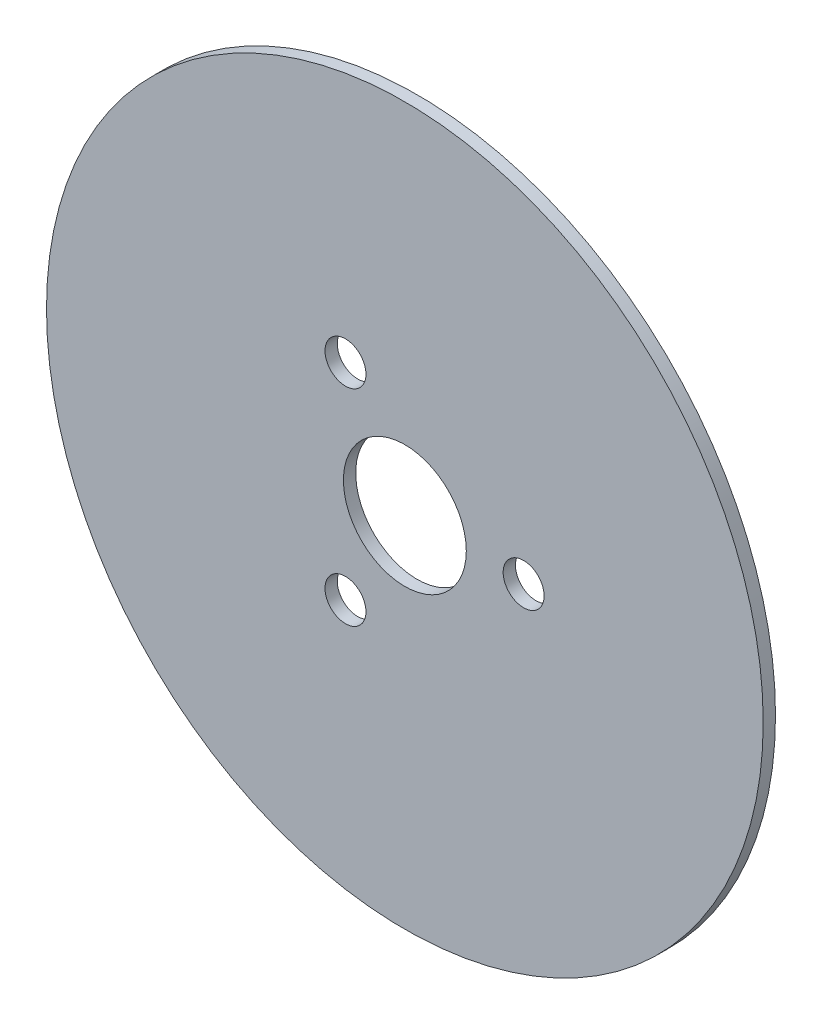
ISO-10303-21;
HEADER;
FILE_DESCRIPTION(('STEP AP214'),'2;1');
FILE_NAME('part.step','',(''),(''),'','','');
FILE_SCHEMA(('AUTOMOTIVE_DESIGN { 1 0 10303 214 1 1 1 1 }'));
ENDSEC;
DATA;
#1=APPLICATION_CONTEXT('core data for automotive mechanical design processes');
#2=APPLICATION_PROTOCOL_DEFINITION('international standard','automotive_design',2000,#1);
#3=PRODUCT_CONTEXT('',#1,'mechanical');
#4=PRODUCT('Part','Part','',(#3));
#5=PRODUCT_RELATED_PRODUCT_CATEGORY('part','',(#4));
#6=PRODUCT_DEFINITION_FORMATION('','',#4);
#7=PRODUCT_DEFINITION_CONTEXT('part definition',#1,'design');
#8=PRODUCT_DEFINITION('design','',#6,#7);
#9=PRODUCT_DEFINITION_SHAPE('','',#8);
#10=(LENGTH_UNIT() NAMED_UNIT(*) SI_UNIT(.MILLI.,.METRE.));
#11=(NAMED_UNIT(*) PLANE_ANGLE_UNIT() SI_UNIT($,.RADIAN.));
#12=(NAMED_UNIT(*) SI_UNIT($,.STERADIAN.) SOLID_ANGLE_UNIT());
#13=UNCERTAINTY_MEASURE_WITH_UNIT(LENGTH_MEASURE(1.E-05),#10,'distance_accuracy_value','');
#14=(GEOMETRIC_REPRESENTATION_CONTEXT(3) GLOBAL_UNCERTAINTY_ASSIGNED_CONTEXT((#13)) GLOBAL_UNIT_ASSIGNED_CONTEXT((#10,
#11,#12)) REPRESENTATION_CONTEXT('',''));
#15=CARTESIAN_POINT('',(0.,0.,0.));
#16=DIRECTION('',(0.,0.,1.));
#17=DIRECTION('',(1.,0.,0.));
#18=AXIS2_PLACEMENT_3D('',#15,#16,#17);
#19=CARTESIAN_POINT('',(0.,0.,3.));
#20=DIRECTION('',(0.,0.,1.));
#21=DIRECTION('',(1.,0.,0.));
#22=AXIS2_PLACEMENT_3D('',#19,#20,#21);
#23=PLANE('',#22);
#24=CARTESIAN_POINT('',(-14.5000000000001,-25.1147367097486,3.));
#25=DIRECTION('',(0.,0.,1.));
#26=DIRECTION('',(1.,0.,0.));
#27=AXIS2_PLACEMENT_3D('',#24,#25,#26);
#28=CIRCLE('',#27,5.);
#29=CARTESIAN_POINT('',(-9.50000000000012,-25.1147367097486,3.));
#30=VERTEX_POINT('',#29);
#31=EDGE_CURVE('E68',#30,#30,#28,.T.);
#32=ORIENTED_EDGE('',*,*,#31,.F.);
#33=EDGE_LOOP('',(#32));
#34=FACE_BOUND('',#33,.T.);
#35=CARTESIAN_POINT('',(0.,0.,3.));
#36=DIRECTION('',(0.,0.,1.));
#37=DIRECTION('',(1.,0.,0.));
#38=AXIS2_PLACEMENT_3D('',#35,#36,#37);
#39=CIRCLE('',#38,15.);
#40=CARTESIAN_POINT('',(15.,0.,3.));
#41=VERTEX_POINT('',#40);
#42=EDGE_CURVE('E54',#41,#41,#39,.T.);
#43=ORIENTED_EDGE('',*,*,#42,.F.);
#44=EDGE_LOOP('',(#43));
#45=FACE_BOUND('',#44,.T.);
#46=CARTESIAN_POINT('',(0.,0.,3.));
#47=DIRECTION('',(0.,0.,1.));
#48=DIRECTION('',(1.,0.,0.));
#49=AXIS2_PLACEMENT_3D('',#46,#47,#48);
#50=CIRCLE('',#49,87.5);
#51=CARTESIAN_POINT('',(87.5,0.,3.));
#52=VERTEX_POINT('',#51);
#53=EDGE_CURVE('E10',#52,#52,#50,.T.);
#54=ORIENTED_EDGE('',*,*,#53,.T.);
#55=EDGE_LOOP('',(#54));
#56=FACE_BOUND('',#55,.T.);
#57=CARTESIAN_POINT('',(29.,0.,3.));
#58=DIRECTION('',(0.,0.,1.));
#59=DIRECTION('',(1.,0.,0.));
#60=AXIS2_PLACEMENT_3D('',#57,#58,#59);
#61=CIRCLE('',#60,5.);
#62=CARTESIAN_POINT('',(34.,0.,3.));
#63=VERTEX_POINT('',#62);
#64=EDGE_CURVE('E60',#63,#63,#61,.T.);
#65=ORIENTED_EDGE('',*,*,#64,.F.);
#66=EDGE_LOOP('',(#65));
#67=FACE_BOUND('',#66,.T.);
#68=CARTESIAN_POINT('',(-14.4999999999998,25.1147367097489,3.));
#69=DIRECTION('',(0.,0.,1.));
#70=DIRECTION('',(1.,0.,0.));
#71=AXIS2_PLACEMENT_3D('',#68,#69,#70);
#72=CIRCLE('',#71,5.);
#73=CARTESIAN_POINT('',(-9.49999999999977,25.1147367097489,3.));
#74=VERTEX_POINT('',#73);
#75=EDGE_CURVE('E76',#74,#74,#72,.T.);
#76=ORIENTED_EDGE('',*,*,#75,.F.);
#77=EDGE_LOOP('',(#76));
#78=FACE_BOUND('',#77,.T.);
#79=ADVANCED_FACE('F41',(#34,#45,#56,#67,#78),#23,.T.);
#80=CARTESIAN_POINT('',(0.,0.,0.));
#81=DIRECTION('',(0.,0.,1.));
#82=DIRECTION('',(1.,0.,0.));
#83=AXIS2_PLACEMENT_3D('',#80,#81,#82);
#84=PLANE('',#83);
#85=CARTESIAN_POINT('',(0.,0.,0.));
#86=DIRECTION('',(0.,0.,1.));
#87=DIRECTION('',(1.,0.,0.));
#88=AXIS2_PLACEMENT_3D('',#85,#86,#87);
#89=CIRCLE('',#88,87.5);
#90=CARTESIAN_POINT('',(87.5,0.,0.));
#91=VERTEX_POINT('',#90);
#92=EDGE_CURVE('E45',#91,#91,#89,.T.);
#93=ORIENTED_EDGE('',*,*,#92,.F.);
#94=EDGE_LOOP('',(#93));
#95=FACE_BOUND('',#94,.T.);
#96=CARTESIAN_POINT('',(0.,0.,0.));
#97=DIRECTION('',(0.,0.,1.));
#98=DIRECTION('',(1.,0.,0.));
#99=AXIS2_PLACEMENT_3D('',#96,#97,#98);
#100=CIRCLE('',#99,15.);
#101=CARTESIAN_POINT('',(15.,0.,0.));
#102=VERTEX_POINT('',#101);
#103=EDGE_CURVE('E56',#102,#102,#100,.T.);
#104=ORIENTED_EDGE('',*,*,#103,.T.);
#105=EDGE_LOOP('',(#104));
#106=FACE_BOUND('',#105,.T.);
#107=CARTESIAN_POINT('',(29.,0.,0.));
#108=DIRECTION('',(0.,0.,1.));
#109=DIRECTION('',(1.,0.,0.));
#110=AXIS2_PLACEMENT_3D('',#107,#108,#109);
#111=CIRCLE('',#110,5.);
#112=CARTESIAN_POINT('',(34.,0.,0.));
#113=VERTEX_POINT('',#112);
#114=EDGE_CURVE('E64',#113,#113,#111,.T.);
#115=ORIENTED_EDGE('',*,*,#114,.T.);
#116=EDGE_LOOP('',(#115));
#117=FACE_BOUND('',#116,.T.);
#118=CARTESIAN_POINT('',(-14.5000000000001,-25.1147367097486,0.));
#119=DIRECTION('',(0.,0.,1.));
#120=DIRECTION('',(1.,0.,0.));
#121=AXIS2_PLACEMENT_3D('',#118,#119,#120);
#122=CIRCLE('',#121,5.);
#123=CARTESIAN_POINT('',(-9.50000000000012,-25.1147367097486,0.));
#124=VERTEX_POINT('',#123);
#125=EDGE_CURVE('E72',#124,#124,#122,.T.);
#126=ORIENTED_EDGE('',*,*,#125,.T.);
#127=EDGE_LOOP('',(#126));
#128=FACE_BOUND('',#127,.T.);
#129=CARTESIAN_POINT('',(-14.4999999999998,25.1147367097489,0.));
#130=DIRECTION('',(0.,0.,1.));
#131=DIRECTION('',(1.,0.,0.));
#132=AXIS2_PLACEMENT_3D('',#129,#130,#131);
#133=CIRCLE('',#132,5.);
#134=CARTESIAN_POINT('',(-9.49999999999977,25.1147367097489,0.));
#135=VERTEX_POINT('',#134);
#136=EDGE_CURVE('E80',#135,#135,#133,.T.);
#137=ORIENTED_EDGE('',*,*,#136,.T.);
#138=EDGE_LOOP('',(#137));
#139=FACE_BOUND('',#138,.T.);
#140=ADVANCED_FACE('F92',(#95,#106,#117,#128,#139),#84,.F.);
#141=CARTESIAN_POINT('',(0.,0.,3.));
#142=DIRECTION('',(0.,0.,-1.));
#143=DIRECTION('',(-1.,0.,0.));
#144=AXIS2_PLACEMENT_3D('',#141,#142,#143);
#145=CYLINDRICAL_SURFACE('',#144,87.5);
#146=ORIENTED_EDGE('',*,*,#53,.F.);
#147=EDGE_LOOP('',(#146));
#148=FACE_BOUND('',#147,.T.);
#149=ORIENTED_EDGE('',*,*,#92,.T.);
#150=EDGE_LOOP('',(#149));
#151=FACE_BOUND('',#150,.T.);
#152=ADVANCED_FACE('F43',(#148,#151),#145,.T.);
#153=CARTESIAN_POINT('',(0.,0.,3.));
#154=DIRECTION('',(0.,0.,-1.));
#155=DIRECTION('',(-1.,0.,0.));
#156=AXIS2_PLACEMENT_3D('',#153,#154,#155);
#157=CYLINDRICAL_SURFACE('',#156,15.);
#158=ORIENTED_EDGE('',*,*,#42,.T.);
#159=EDGE_LOOP('',(#158));
#160=FACE_BOUND('',#159,.T.);
#161=ORIENTED_EDGE('',*,*,#103,.F.);
#162=EDGE_LOOP('',(#161));
#163=FACE_BOUND('',#162,.T.);
#164=ADVANCED_FACE('F102',(#160,#163),#157,.F.);
#165=CARTESIAN_POINT('',(29.,0.,3.));
#166=DIRECTION('',(0.,0.,-1.));
#167=DIRECTION('',(-1.,0.,0.));
#168=AXIS2_PLACEMENT_3D('',#165,#166,#167);
#169=CYLINDRICAL_SURFACE('',#168,5.);
#170=ORIENTED_EDGE('',*,*,#64,.T.);
#171=EDGE_LOOP('',(#170));
#172=FACE_BOUND('',#171,.T.);
#173=ORIENTED_EDGE('',*,*,#114,.F.);
#174=EDGE_LOOP('',(#173));
#175=FACE_BOUND('',#174,.T.);
#176=ADVANCED_FACE('F105',(#172,#175),#169,.F.);
#177=CARTESIAN_POINT('',(-14.5000000000001,-25.1147367097486,3.));
#178=DIRECTION('',(0.,0.,-1.));
#179=DIRECTION('',(-1.,0.,0.));
#180=AXIS2_PLACEMENT_3D('',#177,#178,#179);
#181=CYLINDRICAL_SURFACE('',#180,5.);
#182=ORIENTED_EDGE('',*,*,#31,.T.);
#183=EDGE_LOOP('',(#182));
#184=FACE_BOUND('',#183,.T.);
#185=ORIENTED_EDGE('',*,*,#125,.F.);
#186=EDGE_LOOP('',(#185));
#187=FACE_BOUND('',#186,.T.);
#188=ADVANCED_FACE('F109',(#184,#187),#181,.F.);
#189=CARTESIAN_POINT('',(-14.4999999999998,25.1147367097489,3.));
#190=DIRECTION('',(0.,0.,-1.));
#191=DIRECTION('',(-1.,0.,0.));
#192=AXIS2_PLACEMENT_3D('',#189,#190,#191);
#193=CYLINDRICAL_SURFACE('',#192,5.);
#194=ORIENTED_EDGE('',*,*,#75,.T.);
#195=EDGE_LOOP('',(#194));
#196=FACE_BOUND('',#195,.T.);
#197=ORIENTED_EDGE('',*,*,#136,.F.);
#198=EDGE_LOOP('',(#197));
#199=FACE_BOUND('',#198,.T.);
#200=ADVANCED_FACE('F88',(#196,#199),#193,.F.);
#201=CLOSED_SHELL('',(#79,#140,#152,#164,#176,#188,#200));
#202=MANIFOLD_SOLID_BREP('B2',#201);
#203=ADVANCED_BREP_SHAPE_REPRESENTATION('',(#18,#202),#14);
#204=SHAPE_DEFINITION_REPRESENTATION(#9,#203);
ENDSEC;
END-ISO-10303-21;
